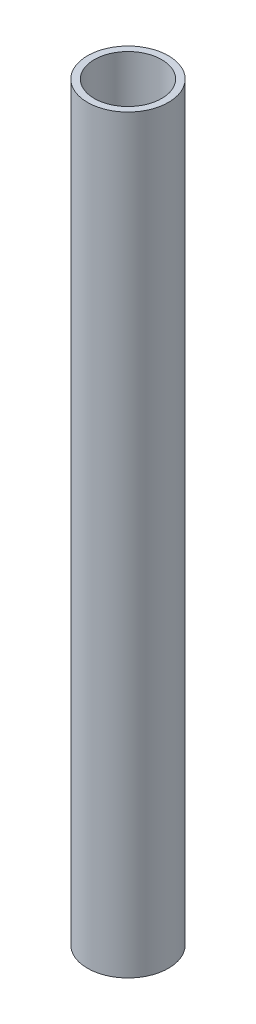
ISO-10303-21;
HEADER;
FILE_DESCRIPTION(('STEP AP214'),'2;1');
FILE_NAME('part.step','',(''),(''),'','','');
FILE_SCHEMA(('AUTOMOTIVE_DESIGN { 1 0 10303 214 1 1 1 1 }'));
ENDSEC;
DATA;
#1=APPLICATION_CONTEXT('core data for automotive mechanical design processes');
#2=APPLICATION_PROTOCOL_DEFINITION('international standard','automotive_design',2000,#1);
#3=PRODUCT_CONTEXT('',#1,'mechanical');
#4=PRODUCT('Part','Part','',(#3));
#5=PRODUCT_RELATED_PRODUCT_CATEGORY('part','',(#4));
#6=PRODUCT_DEFINITION_FORMATION('','',#4);
#7=PRODUCT_DEFINITION_CONTEXT('part definition',#1,'design');
#8=PRODUCT_DEFINITION('design','',#6,#7);
#9=PRODUCT_DEFINITION_SHAPE('','',#8);
#10=(LENGTH_UNIT() NAMED_UNIT(*) SI_UNIT(.MILLI.,.METRE.));
#11=(NAMED_UNIT(*) PLANE_ANGLE_UNIT() SI_UNIT($,.RADIAN.));
#12=(NAMED_UNIT(*) SI_UNIT($,.STERADIAN.) SOLID_ANGLE_UNIT());
#13=UNCERTAINTY_MEASURE_WITH_UNIT(LENGTH_MEASURE(1.E-05),#10,'distance_accuracy_value','');
#14=(GEOMETRIC_REPRESENTATION_CONTEXT(3) GLOBAL_UNCERTAINTY_ASSIGNED_CONTEXT((#13)) GLOBAL_UNIT_ASSIGNED_CONTEXT((#10,
#11,#12)) REPRESENTATION_CONTEXT('',''));
#15=CARTESIAN_POINT('',(0.,0.,0.));
#16=DIRECTION('',(0.,0.,1.));
#17=DIRECTION('',(1.,0.,0.));
#18=AXIS2_PLACEMENT_3D('',#15,#16,#17);
#19=CARTESIAN_POINT('',(0.,55.6,0.));
#20=DIRECTION('',(0.,1.,0.));
#21=DIRECTION('',(0.,0.,1.));
#22=AXIS2_PLACEMENT_3D('',#19,#20,#21);
#23=PLANE('',#22);
#24=CARTESIAN_POINT('',(0.,55.6,0.));
#25=DIRECTION('',(0.,1.,0.));
#26=DIRECTION('',(0.,0.,1.));
#27=AXIS2_PLACEMENT_3D('',#24,#25,#26);
#28=CIRCLE('',#27,3.);
#29=CARTESIAN_POINT('',(0.,55.6,3.));
#30=VERTEX_POINT('',#29);
#31=EDGE_CURVE('E10',#30,#30,#28,.T.);
#32=ORIENTED_EDGE('',*,*,#31,.T.);
#33=EDGE_LOOP('',(#32));
#34=FACE_BOUND('',#33,.T.);
#35=CARTESIAN_POINT('',(0.,55.6,0.));
#36=DIRECTION('',(0.,1.,0.));
#37=DIRECTION('',(0.,0.,1.));
#38=AXIS2_PLACEMENT_3D('',#35,#36,#37);
#39=CIRCLE('',#38,2.5);
#40=CARTESIAN_POINT('',(0.,55.6,2.5));
#41=VERTEX_POINT('',#40);
#42=EDGE_CURVE('E44',#41,#41,#39,.T.);
#43=ORIENTED_EDGE('',*,*,#42,.F.);
#44=EDGE_LOOP('',(#43));
#45=FACE_BOUND('',#44,.T.);
#46=ADVANCED_FACE('F33',(#34,#45),#23,.T.);
#47=CARTESIAN_POINT('',(0.,0.,0.));
#48=DIRECTION('',(0.,1.,0.));
#49=DIRECTION('',(0.,0.,1.));
#50=AXIS2_PLACEMENT_3D('',#47,#48,#49);
#51=PLANE('',#50);
#52=CARTESIAN_POINT('',(0.,0.,0.));
#53=DIRECTION('',(0.,1.,0.));
#54=DIRECTION('',(0.,0.,1.));
#55=AXIS2_PLACEMENT_3D('',#52,#53,#54);
#56=CIRCLE('',#55,3.);
#57=CARTESIAN_POINT('',(0.,0.,3.));
#58=VERTEX_POINT('',#57);
#59=EDGE_CURVE('E37',#58,#58,#56,.T.);
#60=ORIENTED_EDGE('',*,*,#59,.F.);
#61=EDGE_LOOP('',(#60));
#62=FACE_BOUND('',#61,.T.);
#63=CARTESIAN_POINT('',(0.,0.,0.));
#64=DIRECTION('',(0.,1.,0.));
#65=DIRECTION('',(0.,0.,1.));
#66=AXIS2_PLACEMENT_3D('',#63,#64,#65);
#67=CIRCLE('',#66,2.5);
#68=CARTESIAN_POINT('',(0.,0.,2.5));
#69=VERTEX_POINT('',#68);
#70=EDGE_CURVE('E46',#69,#69,#67,.T.);
#71=ORIENTED_EDGE('',*,*,#70,.T.);
#72=EDGE_LOOP('',(#71));
#73=FACE_BOUND('',#72,.T.);
#74=ADVANCED_FACE('F56',(#62,#73),#51,.F.);
#75=CARTESIAN_POINT('',(0.,55.6,0.));
#76=DIRECTION('',(0.,-1.,0.));
#77=DIRECTION('',(0.,0.,-1.));
#78=AXIS2_PLACEMENT_3D('',#75,#76,#77);
#79=CYLINDRICAL_SURFACE('',#78,3.);
#80=ORIENTED_EDGE('',*,*,#31,.F.);
#81=EDGE_LOOP('',(#80));
#82=FACE_BOUND('',#81,.T.);
#83=ORIENTED_EDGE('',*,*,#59,.T.);
#84=EDGE_LOOP('',(#83));
#85=FACE_BOUND('',#84,.T.);
#86=ADVANCED_FACE('F35',(#82,#85),#79,.T.);
#87=CARTESIAN_POINT('',(0.,55.6,0.));
#88=DIRECTION('',(0.,-1.,0.));
#89=DIRECTION('',(0.,0.,-1.));
#90=AXIS2_PLACEMENT_3D('',#87,#88,#89);
#91=CYLINDRICAL_SURFACE('',#90,2.5);
#92=ORIENTED_EDGE('',*,*,#42,.T.);
#93=EDGE_LOOP('',(#92));
#94=FACE_BOUND('',#93,.T.);
#95=ORIENTED_EDGE('',*,*,#70,.F.);
#96=EDGE_LOOP('',(#95));
#97=FACE_BOUND('',#96,.T.);
#98=ADVANCED_FACE('F52',(#94,#97),#91,.F.);
#99=CLOSED_SHELL('',(#46,#74,#86,#98));
#100=MANIFOLD_SOLID_BREP('B2',#99);
#101=ADVANCED_BREP_SHAPE_REPRESENTATION('',(#18,#100),#14);
#102=SHAPE_DEFINITION_REPRESENTATION(#9,#101);
ENDSEC;
END-ISO-10303-21;
